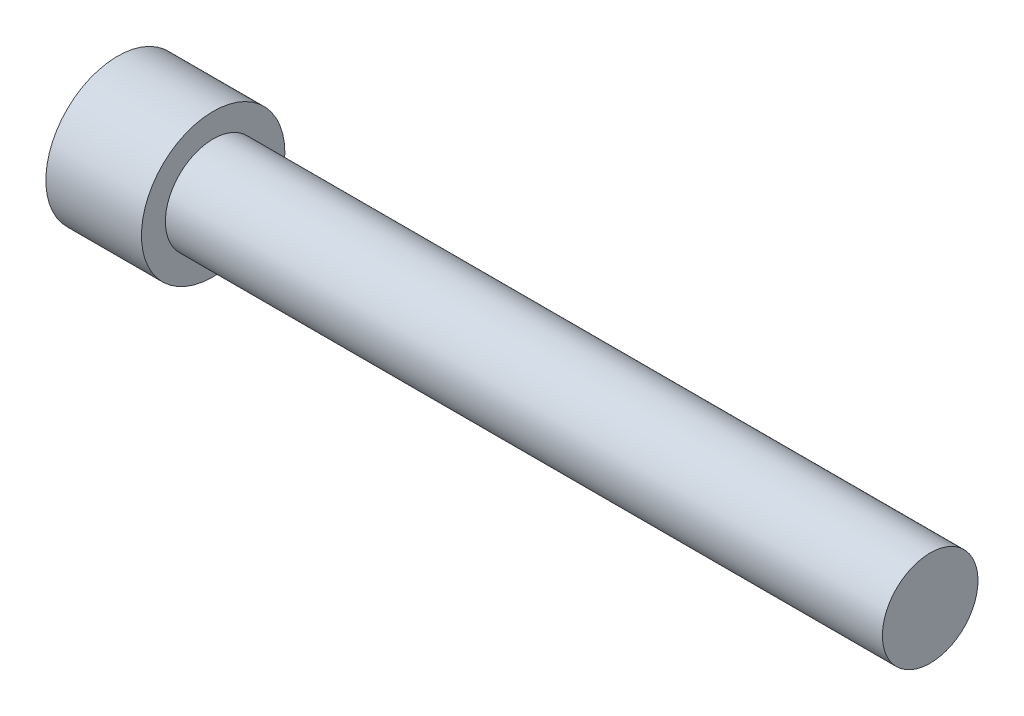
ISO-10303-21;
HEADER;
FILE_DESCRIPTION(('STEP AP214'),'2;1');
FILE_NAME('part.step','',(''),(''),'','','');
FILE_SCHEMA(('AUTOMOTIVE_DESIGN { 1 0 10303 214 1 1 1 1 }'));
ENDSEC;
DATA;
#1=APPLICATION_CONTEXT('core data for automotive mechanical design processes');
#2=APPLICATION_PROTOCOL_DEFINITION('international standard','automotive_design',2000,#1);
#3=PRODUCT_CONTEXT('',#1,'mechanical');
#4=PRODUCT('Part','Part','',(#3));
#5=PRODUCT_RELATED_PRODUCT_CATEGORY('part','',(#4));
#6=PRODUCT_DEFINITION_FORMATION('','',#4);
#7=PRODUCT_DEFINITION_CONTEXT('part definition',#1,'design');
#8=PRODUCT_DEFINITION('design','',#6,#7);
#9=PRODUCT_DEFINITION_SHAPE('','',#8);
#10=(LENGTH_UNIT() NAMED_UNIT(*) SI_UNIT(.MILLI.,.METRE.));
#11=(NAMED_UNIT(*) PLANE_ANGLE_UNIT() SI_UNIT($,.RADIAN.));
#12=(NAMED_UNIT(*) SI_UNIT($,.STERADIAN.) SOLID_ANGLE_UNIT());
#13=UNCERTAINTY_MEASURE_WITH_UNIT(LENGTH_MEASURE(1.E-05),#10,'distance_accuracy_value','');
#14=(GEOMETRIC_REPRESENTATION_CONTEXT(3) GLOBAL_UNCERTAINTY_ASSIGNED_CONTEXT((#13)) GLOBAL_UNIT_ASSIGNED_CONTEXT((#10,
#11,#12)) REPRESENTATION_CONTEXT('',''));
#15=CARTESIAN_POINT('',(0.,0.,0.));
#16=DIRECTION('',(0.,0.,1.));
#17=DIRECTION('',(1.,0.,0.));
#18=AXIS2_PLACEMENT_3D('',#15,#16,#17);
#19=CARTESIAN_POINT('',(4.,0.,0.));
#20=DIRECTION('',(-1.,0.,0.));
#21=DIRECTION('',(0.,0.,1.));
#22=AXIS2_PLACEMENT_3D('',#19,#20,#21);
#23=CYLINDRICAL_SURFACE('',#22,3.);
#24=CARTESIAN_POINT('',(4.,0.,0.));
#25=DIRECTION('',(1.,0.,0.));
#26=DIRECTION('',(0.,0.,-1.));
#27=AXIS2_PLACEMENT_3D('',#24,#25,#26);
#28=CIRCLE('',#27,3.);
#29=CARTESIAN_POINT('',(4.,0.,-3.));
#30=VERTEX_POINT('',#29);
#31=EDGE_CURVE('E47',#30,#30,#28,.T.);
#32=ORIENTED_EDGE('',*,*,#31,.F.);
#33=EDGE_LOOP('',(#32));
#34=FACE_BOUND('',#33,.T.);
#35=CARTESIAN_POINT('',(0.,0.,0.));
#36=DIRECTION('',(1.,0.,0.));
#37=DIRECTION('',(0.,0.,-1.));
#38=AXIS2_PLACEMENT_3D('',#35,#36,#37);
#39=CIRCLE('',#38,3.);
#40=CARTESIAN_POINT('',(0.,0.,-3.));
#41=VERTEX_POINT('',#40);
#42=EDGE_CURVE('E42',#41,#41,#39,.T.);
#43=ORIENTED_EDGE('',*,*,#42,.T.);
#44=EDGE_LOOP('',(#43));
#45=FACE_BOUND('',#44,.T.);
#46=ADVANCED_FACE('F39',(#34,#45),#23,.T.);
#47=CARTESIAN_POINT('',(4.,0.,0.));
#48=DIRECTION('',(1.,0.,0.));
#49=DIRECTION('',(0.,0.,-1.));
#50=AXIS2_PLACEMENT_3D('',#47,#48,#49);
#51=PLANE('',#50);
#52=CARTESIAN_POINT('',(4.,0.,0.));
#53=DIRECTION('',(1.,0.,0.));
#54=DIRECTION('',(0.,0.,-1.));
#55=AXIS2_PLACEMENT_3D('',#52,#53,#54);
#56=CIRCLE('',#55,2.);
#57=CARTESIAN_POINT('',(4.,0.,-2.));
#58=VERTEX_POINT('',#57);
#59=EDGE_CURVE('E10',#58,#58,#56,.T.);
#60=ORIENTED_EDGE('',*,*,#59,.F.);
#61=EDGE_LOOP('',(#60));
#62=FACE_BOUND('',#61,.T.);
#63=ORIENTED_EDGE('',*,*,#31,.T.);
#64=EDGE_LOOP('',(#63));
#65=FACE_BOUND('',#64,.T.);
#66=ADVANCED_FACE('F67',(#62,#65),#51,.T.);
#67=CARTESIAN_POINT('',(0.,0.,0.));
#68=DIRECTION('',(1.,0.,0.));
#69=DIRECTION('',(0.,0.,-1.));
#70=AXIS2_PLACEMENT_3D('',#67,#68,#69);
#71=PLANE('',#70);
#72=ORIENTED_EDGE('',*,*,#42,.F.);
#73=EDGE_LOOP('',(#72));
#74=FACE_BOUND('',#73,.T.);
#75=ADVANCED_FACE('F64',(#74),#71,.F.);
#76=CARTESIAN_POINT('',(34.,0.,0.));
#77=DIRECTION('',(-1.,0.,0.));
#78=DIRECTION('',(0.,0.,1.));
#79=AXIS2_PLACEMENT_3D('',#76,#77,#78);
#80=CYLINDRICAL_SURFACE('',#79,2.);
#81=CARTESIAN_POINT('',(34.,0.,0.));
#82=DIRECTION('',(1.,0.,0.));
#83=DIRECTION('',(0.,0.,-1.));
#84=AXIS2_PLACEMENT_3D('',#81,#82,#83);
#85=CIRCLE('',#84,2.);
#86=CARTESIAN_POINT('',(34.,0.,-2.));
#87=VERTEX_POINT('',#86);
#88=EDGE_CURVE('E54',#87,#87,#85,.T.);
#89=ORIENTED_EDGE('',*,*,#88,.F.);
#90=EDGE_LOOP('',(#89));
#91=FACE_BOUND('',#90,.T.);
#92=ORIENTED_EDGE('',*,*,#59,.T.);
#93=EDGE_LOOP('',(#92));
#94=FACE_BOUND('',#93,.T.);
#95=ADVANCED_FACE('F66',(#91,#94),#80,.T.);
#96=CARTESIAN_POINT('',(34.,0.,0.));
#97=DIRECTION('',(1.,0.,0.));
#98=DIRECTION('',(0.,0.,-1.));
#99=AXIS2_PLACEMENT_3D('',#96,#97,#98);
#100=PLANE('',#99);
#101=ORIENTED_EDGE('',*,*,#88,.T.);
#102=EDGE_LOOP('',(#101));
#103=FACE_BOUND('',#102,.T.);
#104=ADVANCED_FACE('F72',(#103),#100,.T.);
#105=CLOSED_SHELL('',(#46,#66,#75,#95,#104));
#106=MANIFOLD_SOLID_BREP('B2',#105);
#107=ADVANCED_BREP_SHAPE_REPRESENTATION('',(#18,#106),#14);
#108=SHAPE_DEFINITION_REPRESENTATION(#9,#107);
ENDSEC;
END-ISO-10303-21;
